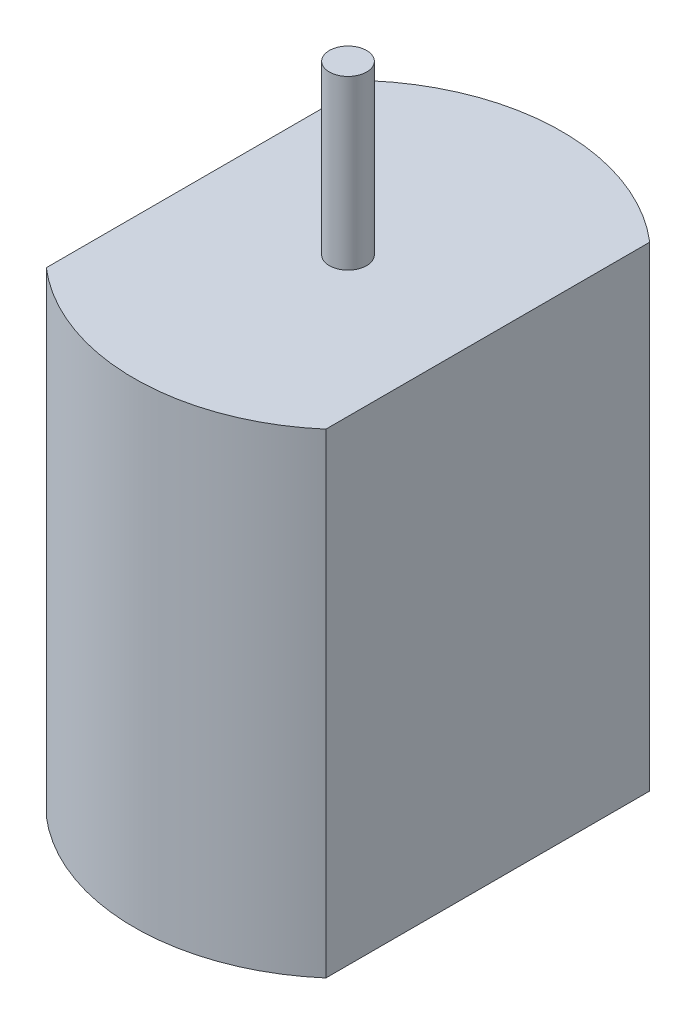
ISO-10303-21;
HEADER;
FILE_DESCRIPTION(('STEP AP214'),'2;1');
FILE_NAME('part.step','',(''),(''),'','','');
FILE_SCHEMA(('AUTOMOTIVE_DESIGN { 1 0 10303 214 1 1 1 1 }'));
ENDSEC;
DATA;
#1=APPLICATION_CONTEXT('core data for automotive mechanical design processes');
#2=APPLICATION_PROTOCOL_DEFINITION('international standard','automotive_design',2000,#1);
#3=PRODUCT_CONTEXT('',#1,'mechanical');
#4=PRODUCT('Part','Part','',(#3));
#5=PRODUCT_RELATED_PRODUCT_CATEGORY('part','',(#4));
#6=PRODUCT_DEFINITION_FORMATION('','',#4);
#7=PRODUCT_DEFINITION_CONTEXT('part definition',#1,'design');
#8=PRODUCT_DEFINITION('design','',#6,#7);
#9=PRODUCT_DEFINITION_SHAPE('','',#8);
#10=(LENGTH_UNIT() NAMED_UNIT(*) SI_UNIT(.MILLI.,.METRE.));
#11=(NAMED_UNIT(*) PLANE_ANGLE_UNIT() SI_UNIT($,.RADIAN.));
#12=(NAMED_UNIT(*) SI_UNIT($,.STERADIAN.) SOLID_ANGLE_UNIT());
#13=UNCERTAINTY_MEASURE_WITH_UNIT(LENGTH_MEASURE(1.E-05),#10,'distance_accuracy_value','');
#14=(GEOMETRIC_REPRESENTATION_CONTEXT(3) GLOBAL_UNCERTAINTY_ASSIGNED_CONTEXT((#13)) GLOBAL_UNIT_ASSIGNED_CONTEXT((#10,
#11,#12)) REPRESENTATION_CONTEXT('',''));
#15=CARTESIAN_POINT('',(0.,0.,0.));
#16=DIRECTION('',(0.,0.,1.));
#17=DIRECTION('',(1.,0.,0.));
#18=AXIS2_PLACEMENT_3D('',#15,#16,#17);
#19=CARTESIAN_POINT('',(0.,0.,0.));
#20=DIRECTION('',(0.,1.,0.));
#21=DIRECTION('',(0.,0.,1.));
#22=AXIS2_PLACEMENT_3D('',#19,#20,#21);
#23=PLANE('',#22);
#24=CARTESIAN_POINT('',(0.,0.,0.));
#25=DIRECTION('',(0.,1.,0.));
#26=DIRECTION('',(0.,0.,1.));
#27=AXIS2_PLACEMENT_3D('',#24,#25,#26);
#28=CIRCLE('',#27,11.4762323842959);
#29=CARTESIAN_POINT('',(-7.5,0.,8.68642099707141));
#30=VERTEX_POINT('',#29);
#31=CARTESIAN_POINT('',(7.5,0.,8.68642099707141));
#32=VERTEX_POINT('',#31);
#33=EDGE_CURVE('E103',#30,#32,#28,.T.);
#34=ORIENTED_EDGE('',*,*,#33,.F.);
#35=DIRECTION('',(0.,0.,1.));
#36=VECTOR('',#35,1.);
#37=CARTESIAN_POINT('',(-7.5,0.,-8.68642099707141));
#38=LINE('',#37,#36);
#39=CARTESIAN_POINT('',(-7.5,0.,-8.68642099707141));
#40=VERTEX_POINT('',#39);
#41=EDGE_CURVE('E120',#40,#30,#38,.T.);
#42=ORIENTED_EDGE('',*,*,#41,.F.);
#43=CARTESIAN_POINT('',(0.,0.,0.));
#44=DIRECTION('',(0.,1.,0.));
#45=DIRECTION('',(0.,0.,1.));
#46=AXIS2_PLACEMENT_3D('',#43,#44,#45);
#47=CIRCLE('',#46,11.4762323842959);
#48=CARTESIAN_POINT('',(7.5,0.,-8.68642099707141));
#49=VERTEX_POINT('',#48);
#50=EDGE_CURVE('E109',#49,#40,#47,.T.);
#51=ORIENTED_EDGE('',*,*,#50,.F.);
#52=DIRECTION('',(0.,0.,1.));
#53=VECTOR('',#52,1.);
#54=CARTESIAN_POINT('',(7.5,0.,0.));
#55=LINE('',#54,#53);
#56=EDGE_CURVE('E115',#49,#32,#55,.T.);
#57=ORIENTED_EDGE('',*,*,#56,.T.);
#58=EDGE_LOOP('',(#34,#42,#51,#57));
#59=FACE_BOUND('',#58,.T.);
#60=ADVANCED_FACE('F65',(#59),#23,.F.);
#61=CARTESIAN_POINT('',(0.,25.5,0.));
#62=DIRECTION('',(0.,-1.,0.));
#63=DIRECTION('',(0.,0.,-1.));
#64=AXIS2_PLACEMENT_3D('',#61,#62,#63);
#65=CYLINDRICAL_SURFACE('',#64,11.4762323842959);
#66=ORIENTED_EDGE('',*,*,#50,.T.);
#67=DIRECTION('',(0.,-1.,0.));
#68=VECTOR('',#67,1.);
#69=CARTESIAN_POINT('',(-7.5,25.5,-8.68642099707141));
#70=LINE('',#69,#68);
#71=CARTESIAN_POINT('',(-7.5,25.5,-8.68642099707141));
#72=VERTEX_POINT('',#71);
#73=EDGE_CURVE('E112',#72,#40,#70,.T.);
#74=ORIENTED_EDGE('',*,*,#73,.F.);
#75=CARTESIAN_POINT('',(0.,25.5,0.));
#76=DIRECTION('',(0.,1.,0.));
#77=DIRECTION('',(0.,0.,1.));
#78=AXIS2_PLACEMENT_3D('',#75,#76,#77);
#79=CIRCLE('',#78,11.4762323842959);
#80=CARTESIAN_POINT('',(7.5,25.5,-8.68642099707141));
#81=VERTEX_POINT('',#80);
#82=EDGE_CURVE('E130',#81,#72,#79,.T.);
#83=ORIENTED_EDGE('',*,*,#82,.F.);
#84=DIRECTION('',(0.,-1.,0.));
#85=VECTOR('',#84,1.);
#86=CARTESIAN_POINT('',(7.5,25.5,-8.68642099707141));
#87=LINE('',#86,#85);
#88=EDGE_CURVE('E75',#81,#49,#87,.T.);
#89=ORIENTED_EDGE('',*,*,#88,.T.);
#90=EDGE_LOOP('',(#66,#74,#83,#89));
#91=FACE_BOUND('',#90,.T.);
#92=ADVANCED_FACE('F111',(#91),#65,.T.);
#93=CARTESIAN_POINT('',(7.5,25.5,0.));
#94=DIRECTION('',(1.,0.,0.));
#95=DIRECTION('',(0.,0.,-1.));
#96=AXIS2_PLACEMENT_3D('',#93,#94,#95);
#97=PLANE('',#96);
#98=ORIENTED_EDGE('',*,*,#56,.F.);
#99=ORIENTED_EDGE('',*,*,#88,.F.);
#100=DIRECTION('',(0.,0.,1.));
#101=VECTOR('',#100,1.);
#102=CARTESIAN_POINT('',(7.5,25.5,0.));
#103=LINE('',#102,#101);
#104=CARTESIAN_POINT('',(7.5,25.5,8.68642099707141));
#105=VERTEX_POINT('',#104);
#106=EDGE_CURVE('E135',#81,#105,#103,.T.);
#107=ORIENTED_EDGE('',*,*,#106,.T.);
#108=DIRECTION('',(0.,-1.,0.));
#109=VECTOR('',#108,1.);
#110=CARTESIAN_POINT('',(7.5,25.5,8.68642099707141));
#111=LINE('',#110,#109);
#112=EDGE_CURVE('E12',#105,#32,#111,.T.);
#113=ORIENTED_EDGE('',*,*,#112,.T.);
#114=EDGE_LOOP('',(#98,#99,#107,#113));
#115=FACE_BOUND('',#114,.T.);
#116=ADVANCED_FACE('F150',(#115),#97,.T.);
#117=CARTESIAN_POINT('',(0.,25.5,0.));
#118=DIRECTION('',(0.,-1.,0.));
#119=DIRECTION('',(0.,0.,-1.));
#120=AXIS2_PLACEMENT_3D('',#117,#118,#119);
#121=CYLINDRICAL_SURFACE('',#120,11.4762323842959);
#122=ORIENTED_EDGE('',*,*,#33,.T.);
#123=ORIENTED_EDGE('',*,*,#112,.F.);
#124=CARTESIAN_POINT('',(0.,25.5,0.));
#125=DIRECTION('',(0.,1.,0.));
#126=DIRECTION('',(0.,0.,1.));
#127=AXIS2_PLACEMENT_3D('',#124,#125,#126);
#128=CIRCLE('',#127,11.4762323842959);
#129=CARTESIAN_POINT('',(-7.5,25.5,8.68642099707141));
#130=VERTEX_POINT('',#129);
#131=EDGE_CURVE('E114',#130,#105,#128,.T.);
#132=ORIENTED_EDGE('',*,*,#131,.F.);
#133=DIRECTION('',(0.,-1.,0.));
#134=VECTOR('',#133,1.);
#135=CARTESIAN_POINT('',(-7.5,25.5,8.68642099707141));
#136=LINE('',#135,#134);
#137=EDGE_CURVE('E69',#130,#30,#136,.T.);
#138=ORIENTED_EDGE('',*,*,#137,.T.);
#139=EDGE_LOOP('',(#122,#123,#132,#138));
#140=FACE_BOUND('',#139,.T.);
#141=ADVANCED_FACE('F146',(#140),#121,.T.);
#142=CARTESIAN_POINT('',(0.,25.5,0.));
#143=DIRECTION('',(0.,1.,0.));
#144=DIRECTION('',(0.,0.,1.));
#145=AXIS2_PLACEMENT_3D('',#142,#143,#144);
#146=PLANE('',#145);
#147=CARTESIAN_POINT('',(0.,25.5,0.));
#148=DIRECTION('',(0.,1.,0.));
#149=DIRECTION('',(0.,0.,1.));
#150=AXIS2_PLACEMENT_3D('',#147,#148,#149);
#151=CIRCLE('',#150,1.);
#152=CARTESIAN_POINT('',(0.,25.5,1.));
#153=VERTEX_POINT('',#152);
#154=EDGE_CURVE('E127',#153,#153,#151,.T.);
#155=ORIENTED_EDGE('',*,*,#154,.F.);
#156=EDGE_LOOP('',(#155));
#157=FACE_BOUND('',#156,.T.);
#158=ORIENTED_EDGE('',*,*,#82,.T.);
#159=DIRECTION('',(0.,0.,1.));
#160=VECTOR('',#159,1.);
#161=CARTESIAN_POINT('',(-7.5,25.5,-8.68642099707141));
#162=LINE('',#161,#160);
#163=EDGE_CURVE('E122',#72,#130,#162,.T.);
#164=ORIENTED_EDGE('',*,*,#163,.T.);
#165=ORIENTED_EDGE('',*,*,#131,.T.);
#166=ORIENTED_EDGE('',*,*,#106,.F.);
#167=EDGE_LOOP('',(#158,#164,#165,#166));
#168=FACE_BOUND('',#167,.T.);
#169=ADVANCED_FACE('F143',(#157,#168),#146,.T.);
#170=CARTESIAN_POINT('',(-7.5,25.5,-8.68642099707141));
#171=DIRECTION('',(1.,0.,0.));
#172=DIRECTION('',(0.,0.,-1.));
#173=AXIS2_PLACEMENT_3D('',#170,#171,#172);
#174=PLANE('',#173);
#175=ORIENTED_EDGE('',*,*,#41,.T.);
#176=ORIENTED_EDGE('',*,*,#137,.F.);
#177=ORIENTED_EDGE('',*,*,#163,.F.);
#178=ORIENTED_EDGE('',*,*,#73,.T.);
#179=EDGE_LOOP('',(#175,#176,#177,#178));
#180=FACE_BOUND('',#179,.T.);
#181=ADVANCED_FACE('F67',(#180),#174,.F.);
#182=CARTESIAN_POINT('',(0.,34.5,0.));
#183=DIRECTION('',(0.,-1.,0.));
#184=DIRECTION('',(0.,0.,-1.));
#185=AXIS2_PLACEMENT_3D('',#182,#183,#184);
#186=CYLINDRICAL_SURFACE('',#185,1.);
#187=CARTESIAN_POINT('',(0.,34.5,0.));
#188=DIRECTION('',(0.,1.,0.));
#189=DIRECTION('',(0.,0.,1.));
#190=AXIS2_PLACEMENT_3D('',#187,#188,#189);
#191=CIRCLE('',#190,1.);
#192=CARTESIAN_POINT('',(0.,34.5,1.));
#193=VERTEX_POINT('',#192);
#194=EDGE_CURVE('E123',#193,#193,#191,.T.);
#195=ORIENTED_EDGE('',*,*,#194,.F.);
#196=EDGE_LOOP('',(#195));
#197=FACE_BOUND('',#196,.T.);
#198=ORIENTED_EDGE('',*,*,#154,.T.);
#199=EDGE_LOOP('',(#198));
#200=FACE_BOUND('',#199,.T.);
#201=ADVANCED_FACE('F141',(#197,#200),#186,.T.);
#202=CARTESIAN_POINT('',(0.,34.5,0.));
#203=DIRECTION('',(0.,1.,0.));
#204=DIRECTION('',(0.,0.,1.));
#205=AXIS2_PLACEMENT_3D('',#202,#203,#204);
#206=PLANE('',#205);
#207=ORIENTED_EDGE('',*,*,#194,.T.);
#208=EDGE_LOOP('',(#207));
#209=FACE_BOUND('',#208,.T.);
#210=ADVANCED_FACE('F166',(#209),#206,.T.);
#211=CLOSED_SHELL('',(#60,#92,#116,#141,#169,#181,#201,#210));
#212=MANIFOLD_SOLID_BREP('B2',#211);
#213=ADVANCED_BREP_SHAPE_REPRESENTATION('',(#18,#212),#14);
#214=SHAPE_DEFINITION_REPRESENTATION(#9,#213);
ENDSEC;
END-ISO-10303-21;
